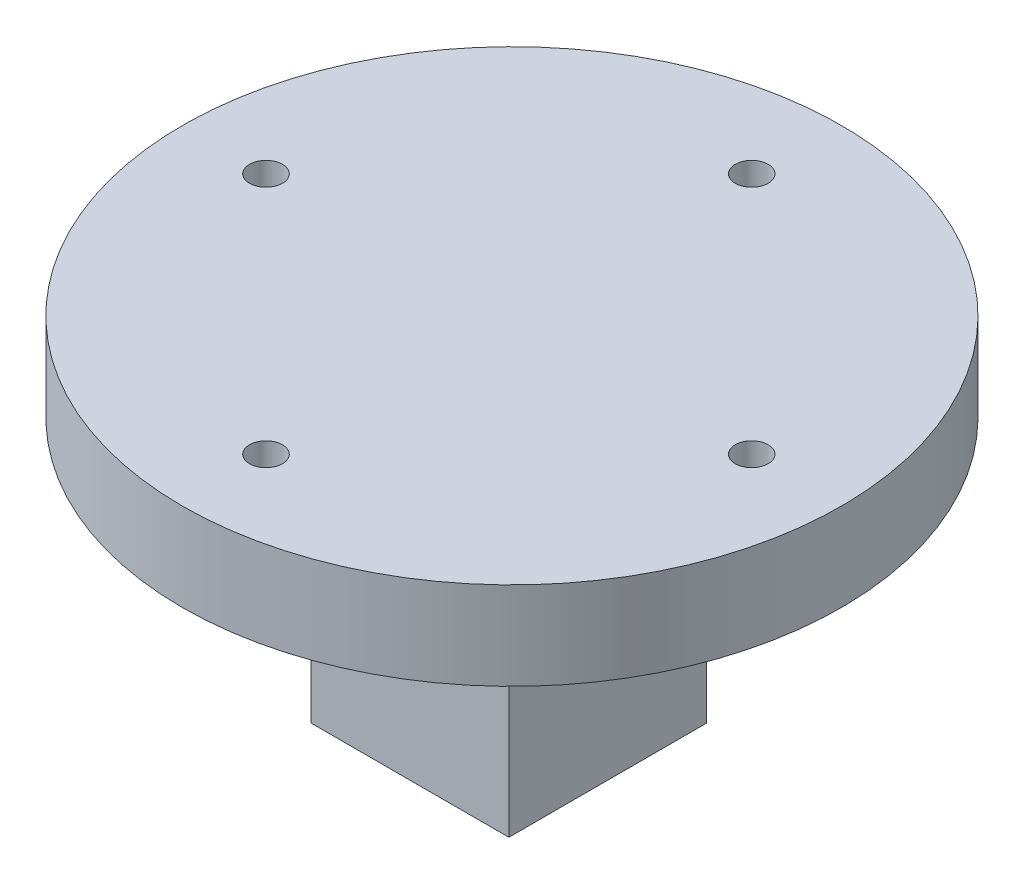
ISO-10303-21;
HEADER;
FILE_DESCRIPTION(('STEP AP214'),'2;1');
FILE_NAME('part.step','',(''),(''),'','','');
FILE_SCHEMA(('AUTOMOTIVE_DESIGN { 1 0 10303 214 1 1 1 1 }'));
ENDSEC;
DATA;
#1=APPLICATION_CONTEXT('core data for automotive mechanical design processes');
#2=APPLICATION_PROTOCOL_DEFINITION('international standard','automotive_design',2000,#1);
#3=PRODUCT_CONTEXT('',#1,'mechanical');
#4=PRODUCT('Part','Part','',(#3));
#5=PRODUCT_RELATED_PRODUCT_CATEGORY('part','',(#4));
#6=PRODUCT_DEFINITION_FORMATION('','',#4);
#7=PRODUCT_DEFINITION_CONTEXT('part definition',#1,'design');
#8=PRODUCT_DEFINITION('design','',#6,#7);
#9=PRODUCT_DEFINITION_SHAPE('','',#8);
#10=(LENGTH_UNIT() NAMED_UNIT(*) SI_UNIT(.MILLI.,.METRE.));
#11=(NAMED_UNIT(*) PLANE_ANGLE_UNIT() SI_UNIT($,.RADIAN.));
#12=(NAMED_UNIT(*) SI_UNIT($,.STERADIAN.) SOLID_ANGLE_UNIT());
#13=UNCERTAINTY_MEASURE_WITH_UNIT(LENGTH_MEASURE(1.E-05),#10,'distance_accuracy_value','');
#14=(GEOMETRIC_REPRESENTATION_CONTEXT(3) GLOBAL_UNCERTAINTY_ASSIGNED_CONTEXT((#13)) GLOBAL_UNIT_ASSIGNED_CONTEXT((#10,
#11,#12)) REPRESENTATION_CONTEXT('',''));
#15=CARTESIAN_POINT('',(0.,0.,0.));
#16=DIRECTION('',(0.,0.,1.));
#17=DIRECTION('',(1.,0.,0.));
#18=AXIS2_PLACEMENT_3D('',#15,#16,#17);
#19=CARTESIAN_POINT('',(9.,24.25,-9.));
#20=DIRECTION('',(-1.,0.,0.));
#21=DIRECTION('',(0.,0.,1.));
#22=AXIS2_PLACEMENT_3D('',#19,#20,#21);
#23=PLANE('',#22);
#24=DIRECTION('',(0.,0.,-1.));
#25=VECTOR('',#24,1.);
#26=CARTESIAN_POINT('',(9.,0.,-9.));
#27=LINE('',#26,#25);
#28=CARTESIAN_POINT('',(9.,0.,9.));
#29=VERTEX_POINT('',#28);
#30=CARTESIAN_POINT('',(9.,0.,-9.));
#31=VERTEX_POINT('',#30);
#32=EDGE_CURVE('E113',#29,#31,#27,.T.);
#33=ORIENTED_EDGE('',*,*,#32,.T.);
#34=DIRECTION('',(0.,-1.,0.));
#35=VECTOR('',#34,1.);
#36=CARTESIAN_POINT('',(9.,24.25,-9.));
#37=LINE('',#36,#35);
#38=CARTESIAN_POINT('',(9.,24.25,-9.));
#39=VERTEX_POINT('',#38);
#40=EDGE_CURVE('E11',#39,#31,#37,.T.);
#41=ORIENTED_EDGE('',*,*,#40,.F.);
#42=DIRECTION('',(0.,0.,-1.));
#43=VECTOR('',#42,1.);
#44=CARTESIAN_POINT('',(9.,24.25,-9.));
#45=LINE('',#44,#43);
#46=CARTESIAN_POINT('',(9.,24.25,9.));
#47=VERTEX_POINT('',#46);
#48=EDGE_CURVE('E92',#47,#39,#45,.T.);
#49=ORIENTED_EDGE('',*,*,#48,.F.);
#50=DIRECTION('',(0.,-1.,0.));
#51=VECTOR('',#50,1.);
#52=CARTESIAN_POINT('',(9.,24.25,9.));
#53=LINE('',#52,#51);
#54=EDGE_CURVE('E94',#47,#29,#53,.T.);
#55=ORIENTED_EDGE('',*,*,#54,.T.);
#56=EDGE_LOOP('',(#33,#41,#49,#55));
#57=FACE_BOUND('',#56,.T.);
#58=ADVANCED_FACE('F43',(#57),#23,.F.);
#59=CARTESIAN_POINT('',(-9.,24.25,-9.));
#60=DIRECTION('',(0.,0.,1.));
#61=DIRECTION('',(1.,0.,0.));
#62=AXIS2_PLACEMENT_3D('',#59,#60,#61);
#63=PLANE('',#62);
#64=DIRECTION('',(-1.,0.,0.));
#65=VECTOR('',#64,1.);
#66=CARTESIAN_POINT('',(-9.,0.,-9.));
#67=LINE('',#66,#65);
#68=CARTESIAN_POINT('',(-9.,0.,-9.));
#69=VERTEX_POINT('',#68);
#70=EDGE_CURVE('E116',#31,#69,#67,.T.);
#71=ORIENTED_EDGE('',*,*,#70,.T.);
#72=DIRECTION('',(0.,-1.,0.));
#73=VECTOR('',#72,1.);
#74=CARTESIAN_POINT('',(-9.,24.25,-9.));
#75=LINE('',#74,#73);
#76=CARTESIAN_POINT('',(-9.,24.25,-9.));
#77=VERTEX_POINT('',#76);
#78=EDGE_CURVE('E52',#77,#69,#75,.T.);
#79=ORIENTED_EDGE('',*,*,#78,.F.);
#80=DIRECTION('',(-1.,0.,0.));
#81=VECTOR('',#80,1.);
#82=CARTESIAN_POINT('',(-9.,24.25,-9.));
#83=LINE('',#82,#81);
#84=EDGE_CURVE('E86',#39,#77,#83,.T.);
#85=ORIENTED_EDGE('',*,*,#84,.F.);
#86=ORIENTED_EDGE('',*,*,#40,.T.);
#87=EDGE_LOOP('',(#71,#79,#85,#86));
#88=FACE_BOUND('',#87,.T.);
#89=ADVANCED_FACE('F129',(#88),#63,.F.);
#90=CARTESIAN_POINT('',(-9.,24.25,-9.));
#91=DIRECTION('',(1.,0.,0.));
#92=DIRECTION('',(0.,0.,-1.));
#93=AXIS2_PLACEMENT_3D('',#90,#91,#92);
#94=PLANE('',#93);
#95=DIRECTION('',(0.,0.,1.));
#96=VECTOR('',#95,1.);
#97=CARTESIAN_POINT('',(-9.,0.,-9.));
#98=LINE('',#97,#96);
#99=CARTESIAN_POINT('',(-9.,0.,9.));
#100=VERTEX_POINT('',#99);
#101=EDGE_CURVE('E76',#69,#100,#98,.T.);
#102=ORIENTED_EDGE('',*,*,#101,.T.);
#103=DIRECTION('',(0.,-1.,0.));
#104=VECTOR('',#103,1.);
#105=CARTESIAN_POINT('',(-9.,24.25,9.));
#106=LINE('',#105,#104);
#107=CARTESIAN_POINT('',(-9.,24.25,9.));
#108=VERTEX_POINT('',#107);
#109=EDGE_CURVE('E60',#108,#100,#106,.T.);
#110=ORIENTED_EDGE('',*,*,#109,.F.);
#111=DIRECTION('',(0.,0.,1.));
#112=VECTOR('',#111,1.);
#113=CARTESIAN_POINT('',(-9.,24.25,-9.));
#114=LINE('',#113,#112);
#115=EDGE_CURVE('E106',#77,#108,#114,.T.);
#116=ORIENTED_EDGE('',*,*,#115,.F.);
#117=ORIENTED_EDGE('',*,*,#78,.T.);
#118=EDGE_LOOP('',(#102,#110,#116,#117));
#119=FACE_BOUND('',#118,.T.);
#120=ADVANCED_FACE('F126',(#119),#94,.F.);
#121=CARTESIAN_POINT('',(-9.,24.25,9.));
#122=DIRECTION('',(0.,0.,-1.));
#123=DIRECTION('',(-1.,0.,0.));
#124=AXIS2_PLACEMENT_3D('',#121,#122,#123);
#125=PLANE('',#124);
#126=DIRECTION('',(1.,0.,0.));
#127=VECTOR('',#126,1.);
#128=CARTESIAN_POINT('',(-9.,0.,9.));
#129=LINE('',#128,#127);
#130=EDGE_CURVE('E81',#100,#29,#129,.T.);
#131=ORIENTED_EDGE('',*,*,#130,.T.);
#132=ORIENTED_EDGE('',*,*,#54,.F.);
#133=DIRECTION('',(1.,0.,0.));
#134=VECTOR('',#133,1.);
#135=CARTESIAN_POINT('',(-9.,24.25,9.));
#136=LINE('',#135,#134);
#137=EDGE_CURVE('E101',#108,#47,#136,.T.);
#138=ORIENTED_EDGE('',*,*,#137,.F.);
#139=ORIENTED_EDGE('',*,*,#109,.T.);
#140=EDGE_LOOP('',(#131,#132,#138,#139));
#141=FACE_BOUND('',#140,.T.);
#142=ADVANCED_FACE('F100',(#141),#125,.F.);
#143=CARTESIAN_POINT('',(0.,0.,0.));
#144=DIRECTION('',(0.,1.,0.));
#145=DIRECTION('',(0.,0.,1.));
#146=AXIS2_PLACEMENT_3D('',#143,#144,#145);
#147=PLANE('',#146);
#148=ORIENTED_EDGE('',*,*,#32,.F.);
#149=ORIENTED_EDGE('',*,*,#130,.F.);
#150=ORIENTED_EDGE('',*,*,#101,.F.);
#151=ORIENTED_EDGE('',*,*,#70,.F.);
#152=EDGE_LOOP('',(#148,#149,#150,#151));
#153=FACE_BOUND('',#152,.T.);
#154=ADVANCED_FACE('F128',(#153),#147,.F.);
#155=CARTESIAN_POINT('',(0.279992144011733,24.25,0.));
#156=DIRECTION('',(0.,1.,0.));
#157=DIRECTION('',(0.,0.,1.));
#158=AXIS2_PLACEMENT_3D('',#155,#156,#157);
#159=PLANE('',#158);
#160=CARTESIAN_POINT('',(0.,24.25,-22.1067147554896));
#161=DIRECTION('',(0.,1.,0.));
#162=DIRECTION('',(0.,0.,1.));
#163=AXIS2_PLACEMENT_3D('',#160,#161,#162);
#164=CIRCLE('',#163,1.5);
#165=CARTESIAN_POINT('',(0.,24.25,-20.6067147554896));
#166=VERTEX_POINT('',#165);
#167=EDGE_CURVE('E175',#166,#166,#164,.T.);
#168=ORIENTED_EDGE('',*,*,#167,.T.);
#169=EDGE_LOOP('',(#168));
#170=FACE_BOUND('',#169,.T.);
#171=CARTESIAN_POINT('',(22.1067147554903,24.25,-6.24249685621605E-13));
#172=DIRECTION('',(0.,1.,0.));
#173=DIRECTION('',(0.,0.,1.));
#174=AXIS2_PLACEMENT_3D('',#171,#172,#173);
#175=CIRCLE('',#174,1.50000000000049);
#176=CARTESIAN_POINT('',(22.1067147554903,24.25,1.49999999999987));
#177=VERTEX_POINT('',#176);
#178=EDGE_CURVE('E178',#177,#177,#175,.T.);
#179=ORIENTED_EDGE('',*,*,#178,.T.);
#180=EDGE_LOOP('',(#179));
#181=FACE_BOUND('',#180,.T.);
#182=CARTESIAN_POINT('',(1.24849937124321E-12,24.25,22.1067147554896));
#183=DIRECTION('',(0.,1.,0.));
#184=DIRECTION('',(0.,0.,1.));
#185=AXIS2_PLACEMENT_3D('',#182,#183,#184);
#186=CIRCLE('',#185,1.50000000000134);
#187=CARTESIAN_POINT('',(1.24849937124321E-12,24.25,23.606714755491));
#188=VERTEX_POINT('',#187);
#189=EDGE_CURVE('E185',#188,#188,#186,.T.);
#190=ORIENTED_EDGE('',*,*,#189,.T.);
#191=EDGE_LOOP('',(#190));
#192=FACE_BOUND('',#191,.T.);
#193=CARTESIAN_POINT('',(-22.106714755489,24.25,6.26956977368103E-13));
#194=DIRECTION('',(0.,1.,0.));
#195=DIRECTION('',(0.,0.,1.));
#196=AXIS2_PLACEMENT_3D('',#193,#194,#195);
#197=CIRCLE('',#196,1.50000000000101);
#198=CARTESIAN_POINT('',(-22.106714755489,24.25,1.50000000000163));
#199=VERTEX_POINT('',#198);
#200=EDGE_CURVE('E200',#199,#199,#197,.T.);
#201=ORIENTED_EDGE('',*,*,#200,.T.);
#202=EDGE_LOOP('',(#201));
#203=FACE_BOUND('',#202,.T.);
#204=CARTESIAN_POINT('',(0.279992144011733,24.25,0.));
#205=DIRECTION('',(0.,1.,0.));
#206=DIRECTION('',(0.,0.,1.));
#207=AXIS2_PLACEMENT_3D('',#204,#205,#206);
#208=CIRCLE('',#207,30.);
#209=CARTESIAN_POINT('',(0.279992144011733,24.25,30.));
#210=VERTEX_POINT('',#209);
#211=EDGE_CURVE('E177',#210,#210,#208,.T.);
#212=ORIENTED_EDGE('',*,*,#211,.F.);
#213=EDGE_LOOP('',(#212));
#214=FACE_BOUND('',#213,.T.);
#215=ORIENTED_EDGE('',*,*,#137,.T.);
#216=ORIENTED_EDGE('',*,*,#48,.T.);
#217=ORIENTED_EDGE('',*,*,#84,.T.);
#218=ORIENTED_EDGE('',*,*,#115,.T.);
#219=EDGE_LOOP('',(#215,#216,#217,#218));
#220=FACE_BOUND('',#219,.T.);
#221=ADVANCED_FACE('F105',(#170,#181,#192,#203,#214,#220),#159,.F.);
#222=CARTESIAN_POINT('',(0.279992144011733,32.25,0.));
#223=DIRECTION('',(0.,-1.,0.));
#224=DIRECTION('',(0.,0.,-1.));
#225=AXIS2_PLACEMENT_3D('',#222,#223,#224);
#226=CYLINDRICAL_SURFACE('',#225,30.);
#227=CARTESIAN_POINT('',(0.279992144011733,32.25,0.));
#228=DIRECTION('',(0.,1.,0.));
#229=DIRECTION('',(0.,0.,1.));
#230=AXIS2_PLACEMENT_3D('',#227,#228,#229);
#231=CIRCLE('',#230,30.);
#232=CARTESIAN_POINT('',(0.279992144011733,32.25,30.));
#233=VERTEX_POINT('',#232);
#234=EDGE_CURVE('E117',#233,#233,#231,.T.);
#235=ORIENTED_EDGE('',*,*,#234,.F.);
#236=EDGE_LOOP('',(#235));
#237=FACE_BOUND('',#236,.T.);
#238=ORIENTED_EDGE('',*,*,#211,.T.);
#239=EDGE_LOOP('',(#238));
#240=FACE_BOUND('',#239,.T.);
#241=ADVANCED_FACE('F141',(#237,#240),#226,.T.);
#242=CARTESIAN_POINT('',(0.279992144011733,32.25,0.));
#243=DIRECTION('',(0.,1.,0.));
#244=DIRECTION('',(0.,0.,1.));
#245=AXIS2_PLACEMENT_3D('',#242,#243,#244);
#246=PLANE('',#245);
#247=CARTESIAN_POINT('',(0.,32.25,-22.1067147554896));
#248=DIRECTION('',(0.,1.,0.));
#249=DIRECTION('',(0.,0.,1.));
#250=AXIS2_PLACEMENT_3D('',#247,#248,#249);
#251=CIRCLE('',#250,1.5);
#252=CARTESIAN_POINT('',(0.,32.25,-20.6067147554896));
#253=VERTEX_POINT('',#252);
#254=EDGE_CURVE('E172',#253,#253,#251,.T.);
#255=ORIENTED_EDGE('',*,*,#254,.F.);
#256=EDGE_LOOP('',(#255));
#257=FACE_BOUND('',#256,.T.);
#258=CARTESIAN_POINT('',(22.1067147554903,32.25,-6.24249685621605E-13));
#259=DIRECTION('',(0.,1.,0.));
#260=DIRECTION('',(0.,0.,1.));
#261=AXIS2_PLACEMENT_3D('',#258,#259,#260);
#262=CIRCLE('',#261,1.50000000000049);
#263=CARTESIAN_POINT('',(22.1067147554903,32.25,1.49999999999987));
#264=VERTEX_POINT('',#263);
#265=EDGE_CURVE('E212',#264,#264,#262,.T.);
#266=ORIENTED_EDGE('',*,*,#265,.F.);
#267=EDGE_LOOP('',(#266));
#268=FACE_BOUND('',#267,.T.);
#269=CARTESIAN_POINT('',(1.24849937124321E-12,32.25,22.1067147554896));
#270=DIRECTION('',(0.,1.,0.));
#271=DIRECTION('',(0.,0.,1.));
#272=AXIS2_PLACEMENT_3D('',#269,#270,#271);
#273=CIRCLE('',#272,1.50000000000134);
#274=CARTESIAN_POINT('',(1.24849937124321E-12,32.25,23.606714755491));
#275=VERTEX_POINT('',#274);
#276=EDGE_CURVE('E208',#275,#275,#273,.T.);
#277=ORIENTED_EDGE('',*,*,#276,.F.);
#278=EDGE_LOOP('',(#277));
#279=FACE_BOUND('',#278,.T.);
#280=CARTESIAN_POINT('',(-22.106714755489,32.25,6.26956977368103E-13));
#281=DIRECTION('',(0.,1.,0.));
#282=DIRECTION('',(0.,0.,1.));
#283=AXIS2_PLACEMENT_3D('',#280,#281,#282);
#284=CIRCLE('',#283,1.50000000000101);
#285=CARTESIAN_POINT('',(-22.106714755489,32.25,1.50000000000163));
#286=VERTEX_POINT('',#285);
#287=EDGE_CURVE('E204',#286,#286,#284,.T.);
#288=ORIENTED_EDGE('',*,*,#287,.F.);
#289=EDGE_LOOP('',(#288));
#290=FACE_BOUND('',#289,.T.);
#291=ORIENTED_EDGE('',*,*,#234,.T.);
#292=EDGE_LOOP('',(#291));
#293=FACE_BOUND('',#292,.T.);
#294=ADVANCED_FACE('F144',(#257,#268,#279,#290,#293),#246,.T.);
#295=CARTESIAN_POINT('',(-22.106714755489,20.25,6.26956977368103E-13));
#296=DIRECTION('',(0.,1.,0.));
#297=DIRECTION('',(0.,0.,1.));
#298=AXIS2_PLACEMENT_3D('',#295,#296,#297);
#299=CYLINDRICAL_SURFACE('',#298,1.50000000000101);
#300=ORIENTED_EDGE('',*,*,#287,.T.);
#301=EDGE_LOOP('',(#300));
#302=FACE_BOUND('',#301,.T.);
#303=ORIENTED_EDGE('',*,*,#200,.F.);
#304=EDGE_LOOP('',(#303));
#305=FACE_BOUND('',#304,.T.);
#306=ADVANCED_FACE('F151',(#302,#305),#299,.F.);
#307=CARTESIAN_POINT('',(1.24849937124321E-12,20.25,22.1067147554896));
#308=DIRECTION('',(0.,1.,0.));
#309=DIRECTION('',(0.,0.,1.));
#310=AXIS2_PLACEMENT_3D('',#307,#308,#309);
#311=CYLINDRICAL_SURFACE('',#310,1.50000000000134);
#312=ORIENTED_EDGE('',*,*,#276,.T.);
#313=EDGE_LOOP('',(#312));
#314=FACE_BOUND('',#313,.T.);
#315=ORIENTED_EDGE('',*,*,#189,.F.);
#316=EDGE_LOOP('',(#315));
#317=FACE_BOUND('',#316,.T.);
#318=ADVANCED_FACE('F155',(#314,#317),#311,.F.);
#319=CARTESIAN_POINT('',(22.1067147554903,20.25,-6.24249685621605E-13));
#320=DIRECTION('',(0.,1.,0.));
#321=DIRECTION('',(0.,0.,1.));
#322=AXIS2_PLACEMENT_3D('',#319,#320,#321);
#323=CYLINDRICAL_SURFACE('',#322,1.50000000000049);
#324=ORIENTED_EDGE('',*,*,#265,.T.);
#325=EDGE_LOOP('',(#324));
#326=FACE_BOUND('',#325,.T.);
#327=ORIENTED_EDGE('',*,*,#178,.F.);
#328=EDGE_LOOP('',(#327));
#329=FACE_BOUND('',#328,.T.);
#330=ADVANCED_FACE('F159',(#326,#329),#323,.F.);
#331=CARTESIAN_POINT('',(0.,20.25,-22.1067147554896));
#332=DIRECTION('',(0.,1.,0.));
#333=DIRECTION('',(0.,0.,1.));
#334=AXIS2_PLACEMENT_3D('',#331,#332,#333);
#335=CYLINDRICAL_SURFACE('',#334,1.5);
#336=ORIENTED_EDGE('',*,*,#254,.T.);
#337=EDGE_LOOP('',(#336));
#338=FACE_BOUND('',#337,.T.);
#339=ORIENTED_EDGE('',*,*,#167,.F.);
#340=EDGE_LOOP('',(#339));
#341=FACE_BOUND('',#340,.T.);
#342=ADVANCED_FACE('F163',(#338,#341),#335,.F.);
#343=CLOSED_SHELL('',(#58,#89,#120,#142,#154,#221,#241,#294,#306,#318,#330,#342));
#344=MANIFOLD_SOLID_BREP('B2',#343);
#345=ADVANCED_BREP_SHAPE_REPRESENTATION('',(#18,#344),#14);
#346=SHAPE_DEFINITION_REPRESENTATION(#9,#345);
ENDSEC;
END-ISO-10303-21;
